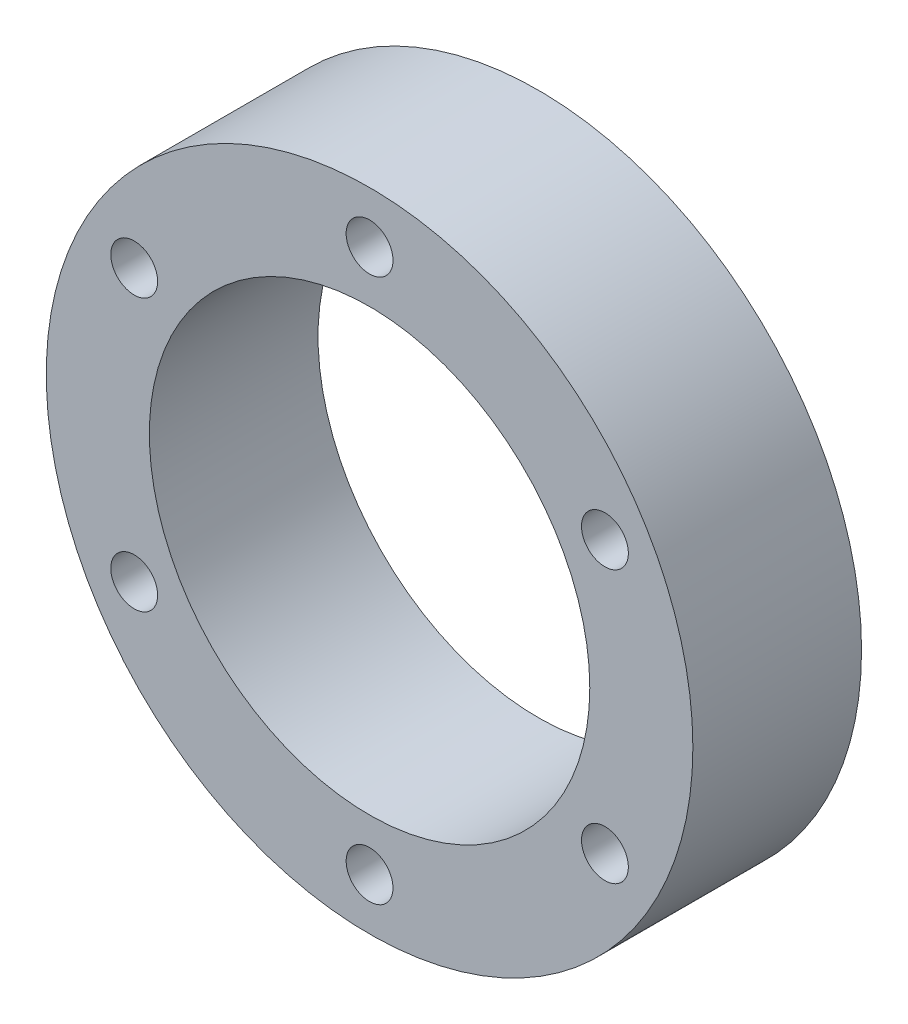
ISO-10303-21;
HEADER;
FILE_DESCRIPTION(('STEP AP214'),'2;1');
FILE_NAME('part.step','',(''),(''),'','','');
FILE_SCHEMA(('AUTOMOTIVE_DESIGN { 1 0 10303 214 1 1 1 1 }'));
ENDSEC;
DATA;
#1=APPLICATION_CONTEXT('core data for automotive mechanical design processes');
#2=APPLICATION_PROTOCOL_DEFINITION('international standard','automotive_design',2000,#1);
#3=PRODUCT_CONTEXT('',#1,'mechanical');
#4=PRODUCT('Part','Part','',(#3));
#5=PRODUCT_RELATED_PRODUCT_CATEGORY('part','',(#4));
#6=PRODUCT_DEFINITION_FORMATION('','',#4);
#7=PRODUCT_DEFINITION_CONTEXT('part definition',#1,'design');
#8=PRODUCT_DEFINITION('design','',#6,#7);
#9=PRODUCT_DEFINITION_SHAPE('','',#8);
#10=(LENGTH_UNIT() NAMED_UNIT(*) SI_UNIT(.MILLI.,.METRE.));
#11=(NAMED_UNIT(*) PLANE_ANGLE_UNIT() SI_UNIT($,.RADIAN.));
#12=(NAMED_UNIT(*) SI_UNIT($,.STERADIAN.) SOLID_ANGLE_UNIT());
#13=UNCERTAINTY_MEASURE_WITH_UNIT(LENGTH_MEASURE(1.E-05),#10,'distance_accuracy_value','');
#14=(GEOMETRIC_REPRESENTATION_CONTEXT(3) GLOBAL_UNCERTAINTY_ASSIGNED_CONTEXT((#13)) GLOBAL_UNIT_ASSIGNED_CONTEXT((#10,
#11,#12)) REPRESENTATION_CONTEXT('',''));
#15=CARTESIAN_POINT('',(0.,0.,0.));
#16=DIRECTION('',(0.,0.,1.));
#17=DIRECTION('',(1.,0.,0.));
#18=AXIS2_PLACEMENT_3D('',#15,#16,#17);
#19=CARTESIAN_POINT('',(0.,0.,18.));
#20=DIRECTION('',(0.,0.,1.));
#21=DIRECTION('',(1.,0.,0.));
#22=AXIS2_PLACEMENT_3D('',#19,#20,#21);
#23=PLANE('',#22);
#24=CARTESIAN_POINT('',(25.1147367097486,14.5000000000003,18.));
#25=DIRECTION('',(0.,0.,1.));
#26=DIRECTION('',(0.50000000000001,-0.866025403784433,0.));
#27=AXIS2_PLACEMENT_3D('',#24,#25,#26);
#28=CIRCLE('',#27,2.5);
#29=CARTESIAN_POINT('',(26.3647367097486,12.3349364905392,18.));
#30=VERTEX_POINT('',#29);
#31=EDGE_CURVE('E66',#30,#30,#28,.T.);
#32=ORIENTED_EDGE('',*,*,#31,.F.);
#33=EDGE_LOOP('',(#32));
#34=FACE_BOUND('',#33,.T.);
#35=CARTESIAN_POINT('',(25.1147367097489,-14.4999999999998,18.));
#36=DIRECTION('',(0.,0.,1.));
#37=DIRECTION('',(-0.499999999999992,-0.866025403784443,0.));
#38=AXIS2_PLACEMENT_3D('',#35,#36,#37);
#39=CIRCLE('',#38,2.5);
#40=CARTESIAN_POINT('',(23.8647367097489,-16.6650635094609,18.));
#41=VERTEX_POINT('',#40);
#42=EDGE_CURVE('E72',#41,#41,#39,.T.);
#43=ORIENTED_EDGE('',*,*,#42,.F.);
#44=EDGE_LOOP('',(#43));
#45=FACE_BOUND('',#44,.T.);
#46=CARTESIAN_POINT('',(0.,-29.,18.));
#47=DIRECTION('',(0.,0.,1.));
#48=DIRECTION('',(-1.,0.,0.));
#49=AXIS2_PLACEMENT_3D('',#46,#47,#48);
#50=CIRCLE('',#49,2.5);
#51=CARTESIAN_POINT('',(-2.5,-29.,18.));
#52=VERTEX_POINT('',#51);
#53=EDGE_CURVE('E78',#52,#52,#50,.T.);
#54=ORIENTED_EDGE('',*,*,#53,.F.);
#55=EDGE_LOOP('',(#54));
#56=FACE_BOUND('',#55,.T.);
#57=CARTESIAN_POINT('',(-25.1147367097487,-14.5000000000001,18.));
#58=DIRECTION('',(0.,0.,1.));
#59=DIRECTION('',(-0.500000000000004,0.866025403784436,0.));
#60=AXIS2_PLACEMENT_3D('',#57,#58,#59);
#61=CIRCLE('',#60,2.5);
#62=CARTESIAN_POINT('',(-26.3647367097487,-12.334936490539,18.));
#63=VERTEX_POINT('',#62);
#64=EDGE_CURVE('E84',#63,#63,#61,.T.);
#65=ORIENTED_EDGE('',*,*,#64,.F.);
#66=EDGE_LOOP('',(#65));
#67=FACE_BOUND('',#66,.T.);
#68=CARTESIAN_POINT('',(-25.1147367097488,14.4999999999999,18.));
#69=DIRECTION('',(0.,0.,1.));
#70=DIRECTION('',(0.499999999999998,0.86602540378444,0.));
#71=AXIS2_PLACEMENT_3D('',#68,#69,#70);
#72=CIRCLE('',#71,2.5);
#73=CARTESIAN_POINT('',(-23.8647367097488,16.665063509461,18.));
#74=VERTEX_POINT('',#73);
#75=EDGE_CURVE('E60',#74,#74,#72,.T.);
#76=ORIENTED_EDGE('',*,*,#75,.F.);
#77=EDGE_LOOP('',(#76));
#78=FACE_BOUND('',#77,.T.);
#79=CARTESIAN_POINT('',(0.,29.,18.));
#80=DIRECTION('',(0.,0.,1.));
#81=DIRECTION('',(1.,0.,0.));
#82=AXIS2_PLACEMENT_3D('',#79,#80,#81);
#83=CIRCLE('',#82,2.5);
#84=CARTESIAN_POINT('',(2.5,29.,18.));
#85=VERTEX_POINT('',#84);
#86=EDGE_CURVE('E54',#85,#85,#83,.T.);
#87=ORIENTED_EDGE('',*,*,#86,.F.);
#88=EDGE_LOOP('',(#87));
#89=FACE_BOUND('',#88,.T.);
#90=CARTESIAN_POINT('',(0.,0.,18.));
#91=DIRECTION('',(0.,0.,1.));
#92=DIRECTION('',(1.,0.,0.));
#93=AXIS2_PLACEMENT_3D('',#90,#91,#92);
#94=CIRCLE('',#93,34.5);
#95=CARTESIAN_POINT('',(34.5,0.,18.));
#96=VERTEX_POINT('',#95);
#97=EDGE_CURVE('E10',#96,#96,#94,.T.);
#98=ORIENTED_EDGE('',*,*,#97,.T.);
#99=EDGE_LOOP('',(#98));
#100=FACE_BOUND('',#99,.T.);
#101=CARTESIAN_POINT('',(0.,0.,18.));
#102=DIRECTION('',(0.,0.,1.));
#103=DIRECTION('',(1.,0.,0.));
#104=AXIS2_PLACEMENT_3D('',#101,#102,#103);
#105=CIRCLE('',#104,23.5);
#106=CARTESIAN_POINT('',(23.5,0.,18.));
#107=VERTEX_POINT('',#106);
#108=EDGE_CURVE('E46',#107,#107,#105,.T.);
#109=ORIENTED_EDGE('',*,*,#108,.F.);
#110=EDGE_LOOP('',(#109));
#111=FACE_BOUND('',#110,.T.);
#112=ADVANCED_FACE('F35',(#34,#45,#56,#67,#78,#89,#100,#111),#23,.T.);
#113=CARTESIAN_POINT('',(0.,0.,0.));
#114=DIRECTION('',(0.,0.,1.));
#115=DIRECTION('',(1.,0.,0.));
#116=AXIS2_PLACEMENT_3D('',#113,#114,#115);
#117=PLANE('',#116);
#118=CARTESIAN_POINT('',(25.1147367097486,14.5000000000003,0.));
#119=DIRECTION('',(0.,0.,1.));
#120=DIRECTION('',(0.50000000000001,-0.866025403784433,0.));
#121=AXIS2_PLACEMENT_3D('',#118,#119,#120);
#122=CIRCLE('',#121,2.5);
#123=CARTESIAN_POINT('',(26.3647367097486,12.3349364905392,0.));
#124=VERTEX_POINT('',#123);
#125=EDGE_CURVE('E69',#124,#124,#122,.T.);
#126=ORIENTED_EDGE('',*,*,#125,.T.);
#127=EDGE_LOOP('',(#126));
#128=FACE_BOUND('',#127,.T.);
#129=CARTESIAN_POINT('',(25.1147367097489,-14.4999999999998,0.));
#130=DIRECTION('',(0.,0.,1.));
#131=DIRECTION('',(-0.499999999999992,-0.866025403784443,0.));
#132=AXIS2_PLACEMENT_3D('',#129,#130,#131);
#133=CIRCLE('',#132,2.5);
#134=CARTESIAN_POINT('',(23.8647367097489,-16.6650635094609,0.));
#135=VERTEX_POINT('',#134);
#136=EDGE_CURVE('E75',#135,#135,#133,.T.);
#137=ORIENTED_EDGE('',*,*,#136,.T.);
#138=EDGE_LOOP('',(#137));
#139=FACE_BOUND('',#138,.T.);
#140=CARTESIAN_POINT('',(0.,-29.,0.));
#141=DIRECTION('',(0.,0.,1.));
#142=DIRECTION('',(-1.,0.,0.));
#143=AXIS2_PLACEMENT_3D('',#140,#141,#142);
#144=CIRCLE('',#143,2.5);
#145=CARTESIAN_POINT('',(-2.5,-29.,0.));
#146=VERTEX_POINT('',#145);
#147=EDGE_CURVE('E81',#146,#146,#144,.T.);
#148=ORIENTED_EDGE('',*,*,#147,.T.);
#149=EDGE_LOOP('',(#148));
#150=FACE_BOUND('',#149,.T.);
#151=CARTESIAN_POINT('',(-25.1147367097487,-14.5000000000001,0.));
#152=DIRECTION('',(0.,0.,1.));
#153=DIRECTION('',(-0.500000000000004,0.866025403784436,0.));
#154=AXIS2_PLACEMENT_3D('',#151,#152,#153);
#155=CIRCLE('',#154,2.5);
#156=CARTESIAN_POINT('',(-26.3647367097487,-12.334936490539,0.));
#157=VERTEX_POINT('',#156);
#158=EDGE_CURVE('E63',#157,#157,#155,.T.);
#159=ORIENTED_EDGE('',*,*,#158,.T.);
#160=EDGE_LOOP('',(#159));
#161=FACE_BOUND('',#160,.T.);
#162=CARTESIAN_POINT('',(-25.1147367097488,14.4999999999999,0.));
#163=DIRECTION('',(0.,0.,1.));
#164=DIRECTION('',(0.499999999999998,0.86602540378444,0.));
#165=AXIS2_PLACEMENT_3D('',#162,#163,#164);
#166=CIRCLE('',#165,2.5);
#167=CARTESIAN_POINT('',(-23.8647367097488,16.665063509461,0.));
#168=VERTEX_POINT('',#167);
#169=EDGE_CURVE('E57',#168,#168,#166,.T.);
#170=ORIENTED_EDGE('',*,*,#169,.T.);
#171=EDGE_LOOP('',(#170));
#172=FACE_BOUND('',#171,.T.);
#173=CARTESIAN_POINT('',(0.,29.,0.));
#174=DIRECTION('',(0.,0.,1.));
#175=DIRECTION('',(1.,0.,0.));
#176=AXIS2_PLACEMENT_3D('',#173,#174,#175);
#177=CIRCLE('',#176,2.5);
#178=CARTESIAN_POINT('',(2.5,29.,0.));
#179=VERTEX_POINT('',#178);
#180=EDGE_CURVE('E51',#179,#179,#177,.T.);
#181=ORIENTED_EDGE('',*,*,#180,.T.);
#182=EDGE_LOOP('',(#181));
#183=FACE_BOUND('',#182,.T.);
#184=CARTESIAN_POINT('',(0.,0.,0.));
#185=DIRECTION('',(0.,0.,1.));
#186=DIRECTION('',(1.,0.,0.));
#187=AXIS2_PLACEMENT_3D('',#184,#185,#186);
#188=CIRCLE('',#187,34.5);
#189=CARTESIAN_POINT('',(34.5,0.,0.));
#190=VERTEX_POINT('',#189);
#191=EDGE_CURVE('E39',#190,#190,#188,.T.);
#192=ORIENTED_EDGE('',*,*,#191,.F.);
#193=EDGE_LOOP('',(#192));
#194=FACE_BOUND('',#193,.T.);
#195=CARTESIAN_POINT('',(0.,0.,0.));
#196=DIRECTION('',(0.,0.,1.));
#197=DIRECTION('',(1.,0.,0.));
#198=AXIS2_PLACEMENT_3D('',#195,#196,#197);
#199=CIRCLE('',#198,23.5);
#200=CARTESIAN_POINT('',(23.5,0.,0.));
#201=VERTEX_POINT('',#200);
#202=EDGE_CURVE('E48',#201,#201,#199,.T.);
#203=ORIENTED_EDGE('',*,*,#202,.T.);
#204=EDGE_LOOP('',(#203));
#205=FACE_BOUND('',#204,.T.);
#206=ADVANCED_FACE('F90',(#128,#139,#150,#161,#172,#183,#194,#205),#117,.F.);
#207=CARTESIAN_POINT('',(0.,0.,18.));
#208=DIRECTION('',(0.,0.,-1.));
#209=DIRECTION('',(-1.,0.,0.));
#210=AXIS2_PLACEMENT_3D('',#207,#208,#209);
#211=CYLINDRICAL_SURFACE('',#210,34.5);
#212=ORIENTED_EDGE('',*,*,#97,.F.);
#213=EDGE_LOOP('',(#212));
#214=FACE_BOUND('',#213,.T.);
#215=ORIENTED_EDGE('',*,*,#191,.T.);
#216=EDGE_LOOP('',(#215));
#217=FACE_BOUND('',#216,.T.);
#218=ADVANCED_FACE('F37',(#214,#217),#211,.T.);
#219=CARTESIAN_POINT('',(0.,0.,18.));
#220=DIRECTION('',(0.,0.,-1.));
#221=DIRECTION('',(-1.,0.,0.));
#222=AXIS2_PLACEMENT_3D('',#219,#220,#221);
#223=CYLINDRICAL_SURFACE('',#222,23.5);
#224=ORIENTED_EDGE('',*,*,#108,.T.);
#225=EDGE_LOOP('',(#224));
#226=FACE_BOUND('',#225,.T.);
#227=ORIENTED_EDGE('',*,*,#202,.F.);
#228=EDGE_LOOP('',(#227));
#229=FACE_BOUND('',#228,.T.);
#230=ADVANCED_FACE('F111',(#226,#229),#223,.F.);
#231=CARTESIAN_POINT('',(0.,29.,0.));
#232=DIRECTION('',(0.,0.,1.));
#233=DIRECTION('',(1.,0.,0.));
#234=AXIS2_PLACEMENT_3D('',#231,#232,#233);
#235=CYLINDRICAL_SURFACE('',#234,2.5);
#236=ORIENTED_EDGE('',*,*,#180,.F.);
#237=EDGE_LOOP('',(#236));
#238=FACE_BOUND('',#237,.T.);
#239=ORIENTED_EDGE('',*,*,#86,.T.);
#240=EDGE_LOOP('',(#239));
#241=FACE_BOUND('',#240,.T.);
#242=ADVANCED_FACE('F114',(#238,#241),#235,.F.);
#243=CARTESIAN_POINT('',(-25.1147367097488,14.4999999999999,0.));
#244=DIRECTION('',(0.,0.,1.));
#245=DIRECTION('',(1.,0.,0.));
#246=AXIS2_PLACEMENT_3D('',#243,#244,#245);
#247=CYLINDRICAL_SURFACE('',#246,2.5);
#248=ORIENTED_EDGE('',*,*,#169,.F.);
#249=EDGE_LOOP('',(#248));
#250=FACE_BOUND('',#249,.T.);
#251=ORIENTED_EDGE('',*,*,#75,.T.);
#252=EDGE_LOOP('',(#251));
#253=FACE_BOUND('',#252,.T.);
#254=ADVANCED_FACE('F97',(#250,#253),#247,.F.);
#255=CARTESIAN_POINT('',(-25.1147367097487,-14.5000000000001,0.));
#256=DIRECTION('',(0.,0.,1.));
#257=DIRECTION('',(1.,0.,0.));
#258=AXIS2_PLACEMENT_3D('',#255,#256,#257);
#259=CYLINDRICAL_SURFACE('',#258,2.5);
#260=ORIENTED_EDGE('',*,*,#158,.F.);
#261=EDGE_LOOP('',(#260));
#262=FACE_BOUND('',#261,.T.);
#263=ORIENTED_EDGE('',*,*,#64,.T.);
#264=EDGE_LOOP('',(#263));
#265=FACE_BOUND('',#264,.T.);
#266=ADVANCED_FACE('F93',(#262,#265),#259,.F.);
#267=CARTESIAN_POINT('',(0.,-29.,0.));
#268=DIRECTION('',(0.,0.,1.));
#269=DIRECTION('',(1.,0.,0.));
#270=AXIS2_PLACEMENT_3D('',#267,#268,#269);
#271=CYLINDRICAL_SURFACE('',#270,2.5);
#272=ORIENTED_EDGE('',*,*,#147,.F.);
#273=EDGE_LOOP('',(#272));
#274=FACE_BOUND('',#273,.T.);
#275=ORIENTED_EDGE('',*,*,#53,.T.);
#276=EDGE_LOOP('',(#275));
#277=FACE_BOUND('',#276,.T.);
#278=ADVANCED_FACE('F96',(#274,#277),#271,.F.);
#279=CARTESIAN_POINT('',(25.1147367097489,-14.4999999999998,0.));
#280=DIRECTION('',(0.,0.,1.));
#281=DIRECTION('',(1.,0.,0.));
#282=AXIS2_PLACEMENT_3D('',#279,#280,#281);
#283=CYLINDRICAL_SURFACE('',#282,2.5);
#284=ORIENTED_EDGE('',*,*,#136,.F.);
#285=EDGE_LOOP('',(#284));
#286=FACE_BOUND('',#285,.T.);
#287=ORIENTED_EDGE('',*,*,#42,.T.);
#288=EDGE_LOOP('',(#287));
#289=FACE_BOUND('',#288,.T.);
#290=ADVANCED_FACE('F135',(#286,#289),#283,.F.);
#291=CARTESIAN_POINT('',(25.1147367097486,14.5000000000003,0.));
#292=DIRECTION('',(0.,0.,1.));
#293=DIRECTION('',(1.,0.,0.));
#294=AXIS2_PLACEMENT_3D('',#291,#292,#293);
#295=CYLINDRICAL_SURFACE('',#294,2.5);
#296=ORIENTED_EDGE('',*,*,#125,.F.);
#297=EDGE_LOOP('',(#296));
#298=FACE_BOUND('',#297,.T.);
#299=ORIENTED_EDGE('',*,*,#31,.T.);
#300=EDGE_LOOP('',(#299));
#301=FACE_BOUND('',#300,.T.);
#302=ADVANCED_FACE('F132',(#298,#301),#295,.F.);
#303=CLOSED_SHELL('',(#112,#206,#218,#230,#242,#254,#266,#278,#290,#302));
#304=MANIFOLD_SOLID_BREP('B2',#303);
#305=ADVANCED_BREP_SHAPE_REPRESENTATION('',(#18,#304),#14);
#306=SHAPE_DEFINITION_REPRESENTATION(#9,#305);
ENDSEC;
END-ISO-10303-21;
